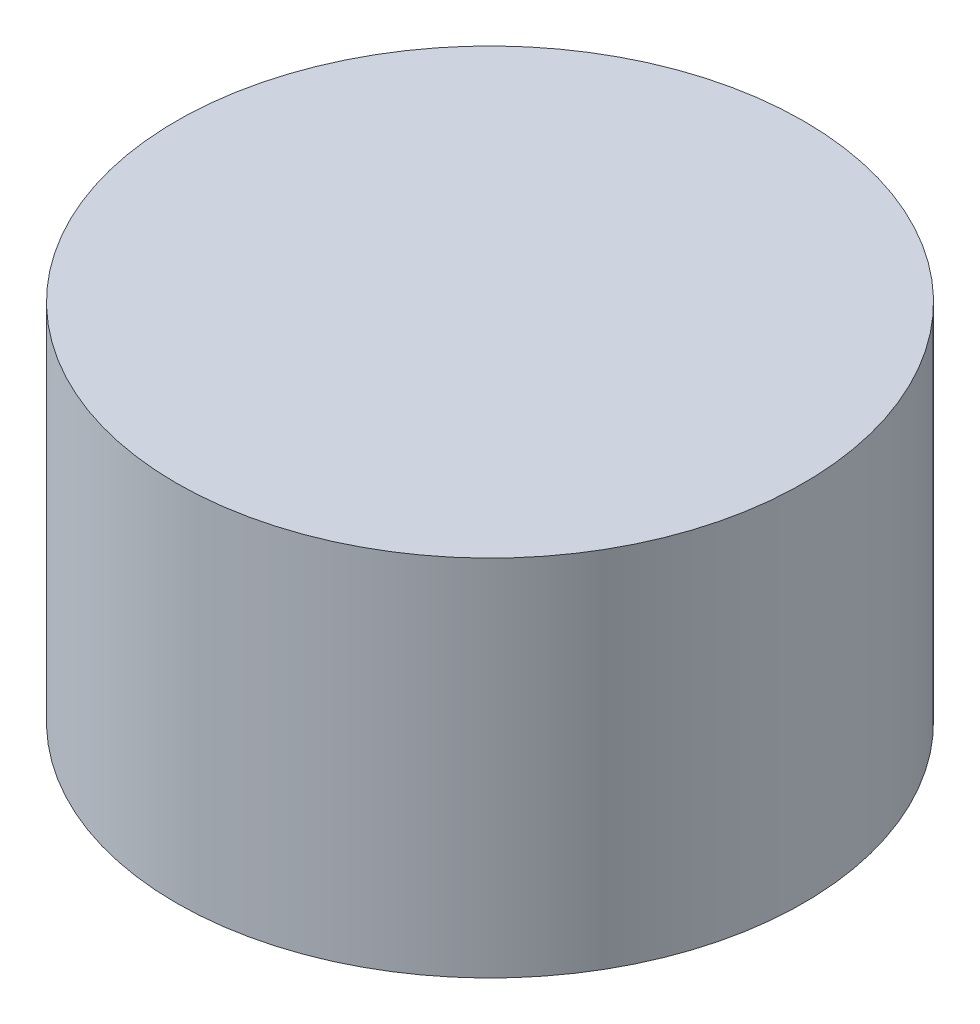
ISO-10303-21;
HEADER;
FILE_DESCRIPTION(('STEP AP214'),'2;1');
FILE_NAME('part.step','',(''),(''),'','','');
FILE_SCHEMA(('AUTOMOTIVE_DESIGN { 1 0 10303 214 1 1 1 1 }'));
ENDSEC;
DATA;
#1=APPLICATION_CONTEXT('core data for automotive mechanical design processes');
#2=APPLICATION_PROTOCOL_DEFINITION('international standard','automotive_design',2000,#1);
#3=PRODUCT_CONTEXT('',#1,'mechanical');
#4=PRODUCT('Part','Part','',(#3));
#5=PRODUCT_RELATED_PRODUCT_CATEGORY('part','',(#4));
#6=PRODUCT_DEFINITION_FORMATION('','',#4);
#7=PRODUCT_DEFINITION_CONTEXT('part definition',#1,'design');
#8=PRODUCT_DEFINITION('design','',#6,#7);
#9=PRODUCT_DEFINITION_SHAPE('','',#8);
#10=(LENGTH_UNIT() NAMED_UNIT(*) SI_UNIT(.MILLI.,.METRE.));
#11=(NAMED_UNIT(*) PLANE_ANGLE_UNIT() SI_UNIT($,.RADIAN.));
#12=(NAMED_UNIT(*) SI_UNIT($,.STERADIAN.) SOLID_ANGLE_UNIT());
#13=UNCERTAINTY_MEASURE_WITH_UNIT(LENGTH_MEASURE(1.E-05),#10,'distance_accuracy_value','');
#14=(GEOMETRIC_REPRESENTATION_CONTEXT(3) GLOBAL_UNCERTAINTY_ASSIGNED_CONTEXT((#13)) GLOBAL_UNIT_ASSIGNED_CONTEXT((#10,
#11,#12)) REPRESENTATION_CONTEXT('',''));
#15=CARTESIAN_POINT('',(0.,0.,0.));
#16=DIRECTION('',(0.,0.,1.));
#17=DIRECTION('',(1.,0.,0.));
#18=AXIS2_PLACEMENT_3D('',#15,#16,#17);
#19=CARTESIAN_POINT('',(0.,2.,0.));
#20=DIRECTION('',(0.,-1.,0.));
#21=DIRECTION('',(0.,0.,-1.));
#22=AXIS2_PLACEMENT_3D('',#19,#20,#21);
#23=CYLINDRICAL_SURFACE('',#22,1.725);
#24=CARTESIAN_POINT('',(0.,2.,0.));
#25=DIRECTION('',(0.,1.,0.));
#26=DIRECTION('',(0.,0.,1.));
#27=AXIS2_PLACEMENT_3D('',#24,#25,#26);
#28=CIRCLE('',#27,1.725);
#29=CARTESIAN_POINT('',(0.,2.,1.725));
#30=VERTEX_POINT('',#29);
#31=EDGE_CURVE('E10',#30,#30,#28,.T.);
#32=ORIENTED_EDGE('',*,*,#31,.F.);
#33=EDGE_LOOP('',(#32));
#34=FACE_BOUND('',#33,.T.);
#35=CARTESIAN_POINT('',(0.,0.,0.));
#36=DIRECTION('',(0.,1.,0.));
#37=DIRECTION('',(0.,0.,1.));
#38=AXIS2_PLACEMENT_3D('',#35,#36,#37);
#39=CIRCLE('',#38,1.725);
#40=CARTESIAN_POINT('',(0.,0.,1.725));
#41=VERTEX_POINT('',#40);
#42=EDGE_CURVE('E50',#41,#41,#39,.T.);
#43=ORIENTED_EDGE('',*,*,#42,.T.);
#44=EDGE_LOOP('',(#43));
#45=FACE_BOUND('',#44,.T.);
#46=ADVANCED_FACE('F47',(#34,#45),#23,.T.);
#47=CARTESIAN_POINT('',(0.,2.,0.));
#48=DIRECTION('',(0.,1.,0.));
#49=DIRECTION('',(0.,0.,1.));
#50=AXIS2_PLACEMENT_3D('',#47,#48,#49);
#51=PLANE('',#50);
#52=ORIENTED_EDGE('',*,*,#31,.T.);
#53=EDGE_LOOP('',(#52));
#54=FACE_BOUND('',#53,.T.);
#55=ADVANCED_FACE('F64',(#54),#51,.T.);
#56=CARTESIAN_POINT('',(0.,0.,0.));
#57=DIRECTION('',(0.,1.,0.));
#58=DIRECTION('',(0.,0.,1.));
#59=AXIS2_PLACEMENT_3D('',#56,#57,#58);
#60=PLANE('',#59);
#61=ORIENTED_EDGE('',*,*,#42,.F.);
#62=EDGE_LOOP('',(#61));
#63=FACE_BOUND('',#62,.T.);
#64=ADVANCED_FACE('F62',(#63),#60,.F.);
#65=CLOSED_SHELL('',(#46,#55,#64));
#66=MANIFOLD_SOLID_BREP('B2',#65);
#67=ADVANCED_BREP_SHAPE_REPRESENTATION('',(#18,#66),#14);
#68=SHAPE_DEFINITION_REPRESENTATION(#9,#67);
ENDSEC;
END-ISO-10303-21;
